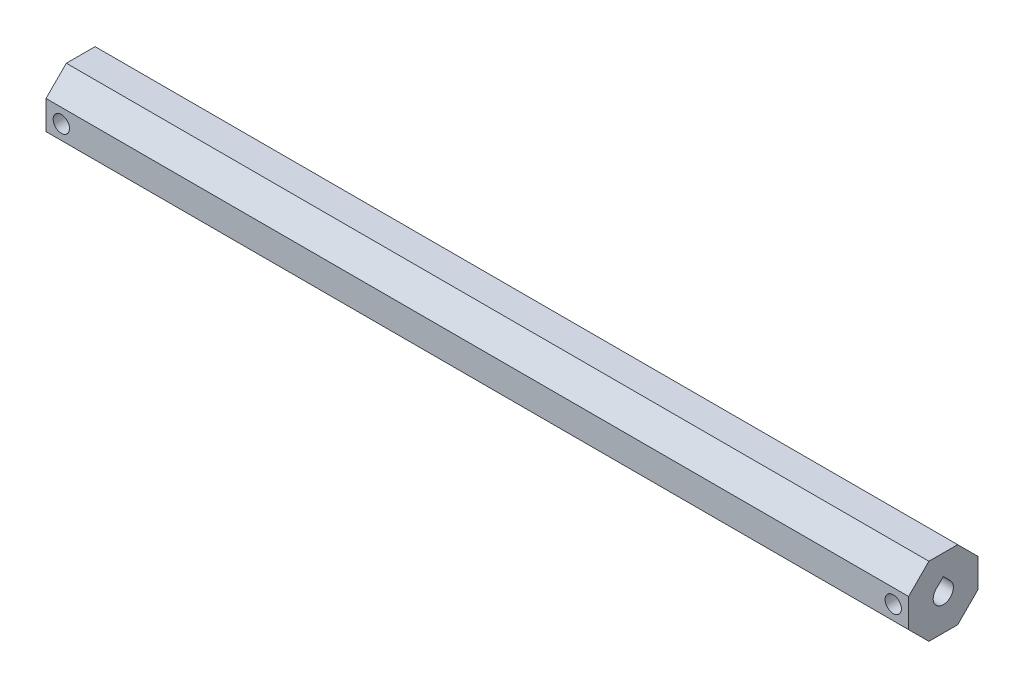
ISO-10303-21;
HEADER;
FILE_DESCRIPTION(('STEP AP214'),'2;1');
FILE_NAME('part.step','',(''),(''),'','','');
FILE_SCHEMA(('AUTOMOTIVE_DESIGN { 1 0 10303 214 1 1 1 1 }'));
ENDSEC;
DATA;
#1=APPLICATION_CONTEXT('core data for automotive mechanical design processes');
#2=APPLICATION_PROTOCOL_DEFINITION('international standard','automotive_design',2000,#1);
#3=PRODUCT_CONTEXT('',#1,'mechanical');
#4=PRODUCT('Part','Part','',(#3));
#5=PRODUCT_RELATED_PRODUCT_CATEGORY('part','',(#4));
#6=PRODUCT_DEFINITION_FORMATION('','',#4);
#7=PRODUCT_DEFINITION_CONTEXT('part definition',#1,'design');
#8=PRODUCT_DEFINITION('design','',#6,#7);
#9=PRODUCT_DEFINITION_SHAPE('','',#8);
#10=(LENGTH_UNIT() NAMED_UNIT(*) SI_UNIT(.MILLI.,.METRE.));
#11=(NAMED_UNIT(*) PLANE_ANGLE_UNIT() SI_UNIT($,.RADIAN.));
#12=(NAMED_UNIT(*) SI_UNIT($,.STERADIAN.) SOLID_ANGLE_UNIT());
#13=UNCERTAINTY_MEASURE_WITH_UNIT(LENGTH_MEASURE(1.E-05),#10,'distance_accuracy_value','');
#14=(GEOMETRIC_REPRESENTATION_CONTEXT(3) GLOBAL_UNCERTAINTY_ASSIGNED_CONTEXT((#13)) GLOBAL_UNIT_ASSIGNED_CONTEXT((#10,
#11,#12)) REPRESENTATION_CONTEXT('',''));
#15=CARTESIAN_POINT('',(0.,0.,0.));
#16=DIRECTION('',(0.,0.,1.));
#17=DIRECTION('',(1.,0.,0.));
#18=AXIS2_PLACEMENT_3D('',#15,#16,#17);
#19=CARTESIAN_POINT('',(0.,0.,0.));
#20=DIRECTION('',(1.,0.,0.));
#21=DIRECTION('',(0.,0.,-1.));
#22=AXIS2_PLACEMENT_3D('',#19,#20,#21);
#23=CYLINDRICAL_SURFACE('',#22,2.63);
#24=CARTESIAN_POINT('',(5.03848447268123,1.85969083452062,1.85969083452062));
#25=CARTESIAN_POINT('',(5.0951160627125,1.82804146435594,1.89135797518973));
#26=CARTESIAN_POINT('',(5.15000136636664,1.79402197696891,1.92374416968312));
#27=CARTESIAN_POINT('',(5.25627855207682,1.72128981403965,1.98907872303995));
#28=CARTESIAN_POINT('',(5.30766821050162,1.68257419399679,2.02202742335799));
#29=CARTESIAN_POINT('',(5.40726992289163,1.60021593778191,2.08782527565308));
#30=CARTESIAN_POINT('',(5.45545396803285,1.55653712105955,2.12067163158908));
#31=CARTESIAN_POINT('',(5.54797875191352,1.46455405557359,2.18520901100423));
#32=CARTESIAN_POINT('',(5.59232072150783,1.41625129866021,2.21690040259083));
#33=CARTESIAN_POINT('',(5.70392621029648,1.28266149181728,2.29806290750954));
#34=CARTESIAN_POINT('',(5.76774691092055,1.19345272932537,2.3459658207599));
#35=CARTESIAN_POINT('',(5.88207084269127,1.00346116916722,2.43327779824418));
#36=CARTESIAN_POINT('',(5.93261851000108,0.902718654771609,2.47271512094149));
#37=CARTESIAN_POINT('',(6.01083299825748,0.708850674166219,2.53435878177116));
#38=CARTESIAN_POINT('',(6.04091362270075,0.617273350655066,2.55834446772752));
#39=CARTESIAN_POINT('',(6.08862339729888,0.428921663345531,2.59656348535034));
#40=CARTESIAN_POINT('',(6.10625504745779,0.332148347209581,2.610798775075));
#41=CARTESIAN_POINT('',(6.12797196683408,0.135742317773496,2.62834985837353));
#42=CARTESIAN_POINT('',(6.13200972521761,0.0361008008171511,2.63162735403424));
#43=CARTESIAN_POINT('',(6.1261150815761,-0.162485649294101,2.62685406841675));
#44=CARTESIAN_POINT('',(6.11618321976725,-0.261430609236712,2.61880372519496));
#45=CARTESIAN_POINT('',(6.08400810229491,-0.449922612376614,2.5928760963468));
#46=CARTESIAN_POINT('',(6.06250809901608,-0.539682526073024,2.57559248248874));
#47=CARTESIAN_POINT('',(6.00887582578313,-0.713885557903072,2.53284828388209));
#48=CARTESIAN_POINT('',(5.97674074700631,-0.798327264428163,2.50738553900094));
#49=CARTESIAN_POINT('',(5.89973771564652,-0.968190560319844,2.4471154699856));
#50=CARTESIAN_POINT('',(5.85395930729148,-1.05296365031704,2.41165643984279));
#51=CARTESIAN_POINT('',(5.75293972542055,-1.21372542864504,2.33489184630584));
#52=CARTESIAN_POINT('',(5.69769374188173,-1.28970961872558,2.29358331292048));
#53=CARTESIAN_POINT('',(5.56673123094268,-1.44735130313582,2.19823072261223));
#54=CARTESIAN_POINT('',(5.48914452607038,-1.52692743271432,2.14332042340501));
#55=CARTESIAN_POINT('',(5.32331713221511,-1.67270683957015,2.03159760187717));
#56=CARTESIAN_POINT('',(5.23506212584814,-1.73889181970878,1.97478259888434));
#57=CARTESIAN_POINT('',(5.05462807776138,-1.85345745172861,1.8674378894907));
#58=CARTESIAN_POINT('',(4.96312129112404,-1.90274127929602,1.81674325516361));
#59=CARTESIAN_POINT('',(4.77080837360695,-1.98841382766638,1.72253803232772));
#60=CARTESIAN_POINT('',(4.67002314973215,-2.02483068642924,1.67901188029474));
#61=CARTESIAN_POINT('',(4.49370290049995,-2.07329506320681,1.61843799463567));
#62=CARTESIAN_POINT('',(4.4206980480358,-2.0894174726342,1.59738652339716));
#63=CARTESIAN_POINT('',(4.27141379944228,-2.11398368605093,1.56473596901652));
#64=CARTESIAN_POINT('',(4.19514265243212,-2.12244576229368,1.55311439956243));
#65=CARTESIAN_POINT('',(4.04065863662922,-2.13102315774334,1.54133261421034));
#66=CARTESIAN_POINT('',(3.96243595024314,-2.13107999374047,1.54125270465107));
#67=CARTESIAN_POINT('',(3.80728712275888,-2.12269157802167,1.55277822386397));
#68=CARTESIAN_POINT('',(3.73036279090047,-2.11423532149556,1.56439877773956));
#69=CARTESIAN_POINT('',(3.56281022395875,-2.0867530378397,1.60093098721445));
#70=CARTESIAN_POINT('',(3.47305901738109,-2.06575585049518,1.62826993410377));
#71=CARTESIAN_POINT('',(3.29992306207162,-2.0137082440087,1.6922078353951));
#72=CARTESIAN_POINT('',(3.2165588394248,-1.98262696548523,1.72883513795149));
#73=CARTESIAN_POINT('',(3.07642578525321,-1.92047259576349,1.79729343683989));
#74=CARTESIAN_POINT('',(3.0182259374661,-1.89134781512773,1.82802753244965));
#75=CARTESIAN_POINT('',(2.90534142736325,-1.82833328862675,1.89105467890705));
#76=CARTESIAN_POINT('',(2.85065837401039,-1.7944413840457,1.9233484316459));
#77=CARTESIAN_POINT('',(2.69172148889042,-1.68576668505589,2.02102613011096));
#78=CARTESIAN_POINT('',(2.59260231491806,-1.60399497338095,2.08719472538144));
#79=CARTESIAN_POINT('',(2.40736108681949,-1.42046975789044,2.21631783662001));
#80=CARTESIAN_POINT('',(2.32153756419276,-1.31835037052084,2.2791819692051));
#81=CARTESIAN_POINT('',(2.16854783093794,-1.09579549059399,2.39409316432904));
#82=CARTESIAN_POINT('',(2.101322731659,-0.975419722412932,2.44617423462145));
#83=CARTESIAN_POINT('',(2.00783409571337,-0.759777513204038,2.51956107151556));
#84=CARTESIAN_POINT('',(1.97534397307195,-0.668730638772767,2.54538528558362));
#85=CARTESIAN_POINT('',(1.92273723428905,-0.480992049145305,2.58742464545609));
#86=CARTESIAN_POINT('',(1.90261104327689,-0.384304765694623,2.60364722659623));
#87=CARTESIAN_POINT('',(1.87592837088297,-0.187421277508353,2.62518911386326));
#88=CARTESIAN_POINT('',(1.86943058368103,-0.0872117775570614,2.63046125821383));
#89=CARTESIAN_POINT('',(1.87064788887946,0.113068693015385,2.62947518816533));
#90=CARTESIAN_POINT('',(1.87836295070491,0.213139663934081,2.62321699857049));
#91=CARTESIAN_POINT('',(1.90649195820296,0.403457408075385,2.60052184341524));
#92=CARTESIAN_POINT('',(1.92604364175712,0.493918959637314,2.58477633952438));
#93=CARTESIAN_POINT('',(1.97598900006543,0.669809330572164,2.54487632597495));
#94=CARTESIAN_POINT('',(2.00638410476584,0.755237484447615,2.5207207072658));
#95=CARTESIAN_POINT('',(2.07950532832982,0.926247222043577,2.4632795156993));
#96=CARTESIAN_POINT('',(2.1230249120794,1.01129159704328,2.42941707627135));
#97=CARTESIAN_POINT('',(2.21956450324894,1.17295835247255,2.35562756141005));
#98=CARTESIAN_POINT('',(2.27259377512116,1.24957240147177,2.31569457780946));
#99=CARTESIAN_POINT('',(2.39835966083387,1.40850924079924,2.22330150774407));
#100=CARTESIAN_POINT('',(2.47291356211949,1.48886214768179,2.16993992809777));
#101=CARTESIAN_POINT('',(2.63233097490823,1.63651635749362,2.06085305126439));
#102=CARTESIAN_POINT('',(2.71718581650323,1.70382851412859,2.00512976719689));
#103=CARTESIAN_POINT('',(2.83192536922825,1.7814066945024,1.93494564820072));
#104=CARTESIAN_POINT('',(2.85731946198986,1.79780360723611,1.91970940907614));
#105=CARTESIAN_POINT('',(2.90884931209322,1.82953674870209,1.88949023850448));
#106=CARTESIAN_POINT('',(2.93498402531604,1.84487437519705,1.87450699375316));
#107=CARTESIAN_POINT('',(2.96151552731877,1.85969083452062,1.85969083452062));
#108=B_SPLINE_CURVE_WITH_KNOTS('',3,(#24,#25,#26,#27,#28,#29,#30,#31,#32,#33,#34,#35,#36,#37,
#38,#39,#40,#41,#42,#43,#44,#45,#46,#47,#48,#49,#50,#51,#52,#53,#54,#55,#56,#57,#58,#59,#60,#61,
#62,#63,#64,#65,#66,#67,#68,#69,#70,#71,#72,#73,#74,#75,#76,#77,#78,#79,#80,#81,#82,#83,#84,#85,
#86,#87,#88,#89,#90,#91,#92,#93,#94,#95,#96,#97,#98,#99,#100,#101,#102,#103,#104,#105,#106,
#107),.UNSPECIFIED.,.F.,.F.,(4,2,2,2,2,2,2,2,2,2,2,2,2,2,2,2,2,2,2,2,2,2,2,2,2,2,2,2,2,2,2,2,2,
2,2,2,2,2,2,2,2,4),(0.,0.21648924591857,0.433114940322423,0.651435591957655,0.869686041348451,
1.22729454456226,1.58369010617176,1.88042295894444,2.17709620483916,2.47480525726397,
2.77250279736244,3.05302719535311,3.33362574166053,3.64049637204913,3.94752337348089,
4.31810368019835,4.6891869637327,5.03509886233567,5.38024955671391,5.6124500892836,
5.84409528138202,6.07735217297174,6.31091098165447,6.59775051445486,6.88547624782633,
7.10112662047158,7.31687496322379,7.7484523809912,8.18863440315681,8.62740628499806,
8.92638085037301,9.22512359115476,9.52515032346801,9.8251764103596,10.1056080075973,
10.3860765996569,10.6890395281592,10.9922992262536,11.3567800019882,11.720956107824,
11.8224907004913,11.9238886487144),.UNSPECIFIED.);
#109=CARTESIAN_POINT('',(5.03848447268123,1.85969083452062,1.85969083452062));
#110=VERTEX_POINT('',#109);
#111=CARTESIAN_POINT('',(2.96151552731877,1.85969083452062,1.85969083452062));
#112=VERTEX_POINT('',#111);
#113=EDGE_CURVE('E61',#110,#112,#108,.T.);
#114=ORIENTED_EDGE('',*,*,#113,.F.);
#115=DIRECTION('',(1.,0.,0.));
#116=VECTOR('',#115,1.);
#117=CARTESIAN_POINT('',(0.,1.85969083452062,1.85969083452062));
#118=LINE('',#117,#116);
#119=CARTESIAN_POINT('',(219.961515527319,1.85969083452062,1.85969083452062));
#120=VERTEX_POINT('',#119);
#121=EDGE_CURVE('E141',#110,#120,#118,.T.);
#122=ORIENTED_EDGE('',*,*,#121,.T.);
#123=CARTESIAN_POINT('',(222.038484472681,1.85969083452062,1.85969083452062));
#124=CARTESIAN_POINT('',(222.095116062712,1.82804146435594,1.89135797518973));
#125=CARTESIAN_POINT('',(222.150001366367,1.79402197696891,1.92374416968311));
#126=CARTESIAN_POINT('',(222.256278552077,1.72128981403966,1.98907872303994));
#127=CARTESIAN_POINT('',(222.307668210502,1.6825741939968,2.02202742335798));
#128=CARTESIAN_POINT('',(222.407269922892,1.60021593778193,2.08782527565306));
#129=CARTESIAN_POINT('',(222.455453968033,1.55653712105957,2.12067163158907));
#130=CARTESIAN_POINT('',(222.547978751913,1.46455405557361,2.18520901100421));
#131=CARTESIAN_POINT('',(222.592320721508,1.41625129866023,2.21690040259081));
#132=CARTESIAN_POINT('',(222.703926210296,1.2826614918173,2.29806290750953));
#133=CARTESIAN_POINT('',(222.767746910921,1.1934527293254,2.34596582075988));
#134=CARTESIAN_POINT('',(222.882070842691,1.00346116916725,2.43327779824417));
#135=CARTESIAN_POINT('',(222.932618510001,0.902718654771629,2.47271512094148));
#136=CARTESIAN_POINT('',(223.010832998257,0.708850674166232,2.53435878177115));
#137=CARTESIAN_POINT('',(223.040913622701,0.617273350655078,2.55834446772752));
#138=CARTESIAN_POINT('',(223.088623397299,0.428921663345544,2.59656348535034));
#139=CARTESIAN_POINT('',(223.106255047458,0.332148347209598,2.610798775075));
#140=CARTESIAN_POINT('',(223.127971966834,0.135742317773517,2.62834985837353));
#141=CARTESIAN_POINT('',(223.132009725218,0.036100800817171,2.63162735403424));
#142=CARTESIAN_POINT('',(223.126115081576,-0.162485649294084,2.62685406841675));
#143=CARTESIAN_POINT('',(223.116183219767,-0.261430609236696,2.61880372519496));
#144=CARTESIAN_POINT('',(223.084008102295,-0.449922612376597,2.5928760963468));
#145=CARTESIAN_POINT('',(223.062508099016,-0.539682526073004,2.57559248248874));
#146=CARTESIAN_POINT('',(223.008875825783,-0.71388555790305,2.5328482838821));
#147=CARTESIAN_POINT('',(222.976740747006,-0.798327264428141,2.50738553900094));
#148=CARTESIAN_POINT('',(222.899737715647,-0.968190560319824,2.44711546998561));
#149=CARTESIAN_POINT('',(222.853959307291,-1.05296365031702,2.4116564398428));
#150=CARTESIAN_POINT('',(222.752939725421,-1.21372542864502,2.33489184630584));
#151=CARTESIAN_POINT('',(222.697693741882,-1.28970961872555,2.29358331292049));
#152=CARTESIAN_POINT('',(222.566731230943,-1.4473513031358,2.19823072261225));
#153=CARTESIAN_POINT('',(222.48914452607,-1.52692743271431,2.14332042340501));
#154=CARTESIAN_POINT('',(222.323317132215,-1.67270683957014,2.03159760187718));
#155=CARTESIAN_POINT('',(222.235062125848,-1.73889181970877,1.97478259888435));
#156=CARTESIAN_POINT('',(222.054628077761,-1.8534574517286,1.86743788949071));
#157=CARTESIAN_POINT('',(221.963121291124,-1.90274127929601,1.81674325516362));
#158=CARTESIAN_POINT('',(221.770808373607,-1.98841382766637,1.72253803232773));
#159=CARTESIAN_POINT('',(221.670023149732,-2.02483068642924,1.67901188029474));
#160=CARTESIAN_POINT('',(221.4937029005,-2.0732950632068,1.61843799463568));
#161=CARTESIAN_POINT('',(221.420698048036,-2.08941747263419,1.59738652339716));
#162=CARTESIAN_POINT('',(221.271413799442,-2.11398368605092,1.56473596901653));
#163=CARTESIAN_POINT('',(221.195142652432,-2.12244576229368,1.55311439956244));
#164=CARTESIAN_POINT('',(221.040658636629,-2.13102315774333,1.54133261421035));
#165=CARTESIAN_POINT('',(220.962435950243,-2.13107999374046,1.54125270465107));
#166=CARTESIAN_POINT('',(220.807287122759,-2.12269157802167,1.55277822386398));
#167=CARTESIAN_POINT('',(220.730362790901,-2.11423532149555,1.56439877773957));
#168=CARTESIAN_POINT('',(220.562810223959,-2.0867530378397,1.60093098721445));
#169=CARTESIAN_POINT('',(220.473059017381,-2.06575585049519,1.62826993410376));
#170=CARTESIAN_POINT('',(220.299923062072,-2.01370824400871,1.69220783539509));
#171=CARTESIAN_POINT('',(220.216558839425,-1.98262696548524,1.72883513795148));
#172=CARTESIAN_POINT('',(220.076425785253,-1.9204725957635,1.79729343683987));
#173=CARTESIAN_POINT('',(220.018225937466,-1.89134781512774,1.82802753244964));
#174=CARTESIAN_POINT('',(219.905341427363,-1.82833328862676,1.89105467890704));
#175=CARTESIAN_POINT('',(219.85065837401,-1.79444138404571,1.92334843164589));
#176=CARTESIAN_POINT('',(219.69172148889,-1.68576668505591,2.02102613011095));
#177=CARTESIAN_POINT('',(219.592602314918,-1.60399497338096,2.08719472538143));
#178=CARTESIAN_POINT('',(219.407361086819,-1.42046975789046,2.21631783662));
#179=CARTESIAN_POINT('',(219.321537564193,-1.31835037052086,2.27918196920509));
#180=CARTESIAN_POINT('',(219.168547830938,-1.09579549059402,2.39409316432902));
#181=CARTESIAN_POINT('',(219.101322731659,-0.975419722412965,2.44617423462144));
#182=CARTESIAN_POINT('',(219.007834095713,-0.759777513204085,2.51956107151555));
#183=CARTESIAN_POINT('',(218.975343973072,-0.668730638772819,2.54538528558361));
#184=CARTESIAN_POINT('',(218.922737234289,-0.480992049145359,2.58742464545608));
#185=CARTESIAN_POINT('',(218.902611043277,-0.384304765694675,2.60364722659623));
#186=CARTESIAN_POINT('',(218.875928370883,-0.187421277508406,2.62518911386326));
#187=CARTESIAN_POINT('',(218.869430583681,-0.0872117775571169,2.63046125821383));
#188=CARTESIAN_POINT('',(218.870647888879,0.113068693015326,2.62947518816533));
#189=CARTESIAN_POINT('',(218.878362950705,0.213139663934022,2.62321699857049));
#190=CARTESIAN_POINT('',(218.906491958203,0.403457408075326,2.60052184341525));
#191=CARTESIAN_POINT('',(218.926043641757,0.493918959637257,2.5847763395244));
#192=CARTESIAN_POINT('',(218.975989000065,0.66980933057211,2.54487632597496));
#193=CARTESIAN_POINT('',(219.006384104766,0.755237484447562,2.52072070726581));
#194=CARTESIAN_POINT('',(219.07950532833,0.926247222043523,2.46327951569932));
#195=CARTESIAN_POINT('',(219.123024912079,1.01129159704323,2.42941707627138));
#196=CARTESIAN_POINT('',(219.219564503249,1.17295835247249,2.35562756141007));
#197=CARTESIAN_POINT('',(219.272593775121,1.24957240147171,2.31569457780949));
#198=CARTESIAN_POINT('',(219.398359660834,1.40850924079919,2.2233015077441));
#199=CARTESIAN_POINT('',(219.472913562119,1.48886214768174,2.1699399280978));
#200=CARTESIAN_POINT('',(219.632330974908,1.63651635749358,2.06085305126442));
#201=CARTESIAN_POINT('',(219.717185816503,1.70382851412855,2.00512976719693));
#202=CARTESIAN_POINT('',(219.831925369228,1.78140669450237,1.93494564820075));
#203=CARTESIAN_POINT('',(219.85731946199,1.79780360723608,1.91970940907617));
#204=CARTESIAN_POINT('',(219.908849312093,1.82953674870208,1.88949023850449));
#205=CARTESIAN_POINT('',(219.934984025316,1.84487437519704,1.87450699375317));
#206=CARTESIAN_POINT('',(219.961515527319,1.85969083452062,1.85969083452062));
#207=B_SPLINE_CURVE_WITH_KNOTS('',3,(#123,#124,#125,#126,#127,#128,#129,#130,#131,#132,#133,
#134,#135,#136,#137,#138,#139,#140,#141,#142,#143,#144,#145,#146,#147,#148,#149,#150,#151,#152,
#153,#154,#155,#156,#157,#158,#159,#160,#161,#162,#163,#164,#165,#166,#167,#168,#169,#170,#171,
#172,#173,#174,#175,#176,#177,#178,#179,#180,#181,#182,#183,#184,#185,#186,#187,#188,#189,#190,
#191,#192,#193,#194,#195,#196,#197,#198,#199,#200,#201,#202,#203,#204,#205,#206),.UNSPECIFIED.,
.F.,.F.,(4,2,2,2,2,2,2,2,2,2,2,2,2,2,2,2,2,2,2,2,2,2,2,2,2,2,2,2,2,2,2,2,2,2,2,2,2,2,2,2,2,4),
(0.,0.21648924591855,0.433114940322415,0.651435591957615,0.869686041348436,1.22729454456224,
1.58369010617175,1.88042295894445,2.17709620483915,2.47480525726397,2.77250279736244,
3.05302719535311,3.33362574166052,3.64049637204912,3.94752337348088,4.31810368019836,
4.6891869637327,5.03509886233568,5.38024955671394,5.6124500892836,5.84409528138201,
6.07735217297174,6.31091098165444,6.59775051445479,6.88547624782628,7.10112662047153,
7.31687496322377,7.74845238099118,8.18863440315679,8.627406284998,8.92638085037295,
9.22512359115471,9.52515032346794,9.82517641035953,10.1056080075973,10.3860765996568,
10.6890395281592,10.9922992262535,11.3567800019881,11.7209561078239,11.8224907004912,
11.9238886487144),.UNSPECIFIED.);
#208=CARTESIAN_POINT('',(222.038484472681,1.85969083452062,1.85969083452062));
#209=VERTEX_POINT('',#208);
#210=EDGE_CURVE('E55',#209,#120,#207,.T.);
#211=ORIENTED_EDGE('',*,*,#210,.F.);
#212=CARTESIAN_POINT('',(225.,1.85969083452062,1.85969083452062));
#213=VERTEX_POINT('',#212);
#214=EDGE_CURVE('E139',#209,#213,#118,.T.);
#215=ORIENTED_EDGE('',*,*,#214,.T.);
#216=CARTESIAN_POINT('',(225.,0.,0.));
#217=DIRECTION('',(1.,0.,0.));
#218=DIRECTION('',(0.,0.,-1.));
#219=AXIS2_PLACEMENT_3D('',#216,#217,#218);
#220=CIRCLE('',#219,2.63);
#221=CARTESIAN_POINT('',(225.,1.85969083452062,-1.85969083452062));
#222=VERTEX_POINT('',#221);
#223=EDGE_CURVE('E291',#213,#222,#220,.T.);
#224=ORIENTED_EDGE('',*,*,#223,.T.);
#225=DIRECTION('',(1.,0.,0.));
#226=VECTOR('',#225,1.);
#227=CARTESIAN_POINT('',(0.,1.85969083452062,-1.85969083452062));
#228=LINE('',#227,#226);
#229=CARTESIAN_POINT('',(0.,1.85969083452062,-1.85969083452062));
#230=VERTEX_POINT('',#229);
#231=EDGE_CURVE('E151',#230,#222,#228,.T.);
#232=ORIENTED_EDGE('',*,*,#231,.F.);
#233=CARTESIAN_POINT('',(0.,0.,0.));
#234=DIRECTION('',(1.,0.,0.));
#235=DIRECTION('',(0.,0.,-1.));
#236=AXIS2_PLACEMENT_3D('',#233,#234,#235);
#237=CIRCLE('',#236,2.63);
#238=CARTESIAN_POINT('',(0.,1.85969083452062,1.85969083452062));
#239=VERTEX_POINT('',#238);
#240=EDGE_CURVE('E292',#239,#230,#237,.T.);
#241=ORIENTED_EDGE('',*,*,#240,.F.);
#242=EDGE_CURVE('E150',#239,#112,#118,.T.);
#243=ORIENTED_EDGE('',*,*,#242,.T.);
#244=EDGE_LOOP('',(#114,#122,#211,#215,#224,#232,#241,#243));
#245=FACE_BOUND('',#244,.T.);
#246=ADVANCED_FACE('F41',(#245),#23,.F.);
#247=CARTESIAN_POINT('',(225.,-9.0533008588991,-3.74999999999999));
#248=DIRECTION('',(0.,0.707106781186548,0.707106781186547));
#249=DIRECTION('',(0.,-0.707106781186547,0.707106781186548));
#250=AXIS2_PLACEMENT_3D('',#247,#248,#249);
#251=PLANE('',#250);
#252=DIRECTION('',(0.,0.707106781186547,-0.707106781186548));
#253=VECTOR('',#252,1.);
#254=CARTESIAN_POINT('',(0.,-9.0533008588991,-3.74999999999999));
#255=LINE('',#254,#253);
#256=CARTESIAN_POINT('',(0.,-9.0533008588991,-3.74999999999999));
#257=VERTEX_POINT('',#256);
#258=CARTESIAN_POINT('',(0.,-3.75,-9.0533008588991));
#259=VERTEX_POINT('',#258);
#260=EDGE_CURVE('E155',#257,#259,#255,.T.);
#261=ORIENTED_EDGE('',*,*,#260,.T.);
#262=DIRECTION('',(-1.,0.,0.));
#263=VECTOR('',#262,1.);
#264=CARTESIAN_POINT('',(225.,-3.75,-9.0533008588991));
#265=LINE('',#264,#263);
#266=CARTESIAN_POINT('',(225.,-3.75,-9.0533008588991));
#267=VERTEX_POINT('',#266);
#268=EDGE_CURVE('E137',#267,#259,#265,.T.);
#269=ORIENTED_EDGE('',*,*,#268,.F.);
#270=DIRECTION('',(0.,0.707106781186547,-0.707106781186548));
#271=VECTOR('',#270,1.);
#272=CARTESIAN_POINT('',(225.,-9.0533008588991,-3.74999999999999));
#273=LINE('',#272,#271);
#274=CARTESIAN_POINT('',(225.,-9.0533008588991,-3.74999999999999));
#275=VERTEX_POINT('',#274);
#276=EDGE_CURVE('E181',#275,#267,#273,.T.);
#277=ORIENTED_EDGE('',*,*,#276,.F.);
#278=DIRECTION('',(-1.,0.,0.));
#279=VECTOR('',#278,1.);
#280=CARTESIAN_POINT('',(225.,-9.0533008588991,-3.74999999999999));
#281=LINE('',#280,#279);
#282=EDGE_CURVE('E182',#275,#257,#281,.T.);
#283=ORIENTED_EDGE('',*,*,#282,.T.);
#284=EDGE_LOOP('',(#261,#269,#277,#283));
#285=FACE_BOUND('',#284,.T.);
#286=ADVANCED_FACE('F43',(#285),#251,.F.);
#287=CARTESIAN_POINT('',(225.,-3.75,-9.0533008588991));
#288=DIRECTION('',(0.,0.,1.));
#289=DIRECTION('',(1.,0.,0.));
#290=AXIS2_PLACEMENT_3D('',#287,#288,#289);
#291=PLANE('',#290);
#292=DIRECTION('',(0.,1.,0.));
#293=VECTOR('',#292,1.);
#294=CARTESIAN_POINT('',(0.,-3.75,-9.0533008588991));
#295=LINE('',#294,#293);
#296=CARTESIAN_POINT('',(0.,3.75,-9.0533008588991));
#297=VERTEX_POINT('',#296);
#298=EDGE_CURVE('E158',#259,#297,#295,.T.);
#299=ORIENTED_EDGE('',*,*,#298,.T.);
#300=DIRECTION('',(-1.,0.,0.));
#301=VECTOR('',#300,1.);
#302=CARTESIAN_POINT('',(225.,3.75,-9.0533008588991));
#303=LINE('',#302,#301);
#304=CARTESIAN_POINT('',(225.,3.75,-9.0533008588991));
#305=VERTEX_POINT('',#304);
#306=EDGE_CURVE('E199',#305,#297,#303,.T.);
#307=ORIENTED_EDGE('',*,*,#306,.F.);
#308=DIRECTION('',(0.,1.,0.));
#309=VECTOR('',#308,1.);
#310=CARTESIAN_POINT('',(225.,-3.75,-9.0533008588991));
#311=LINE('',#310,#309);
#312=EDGE_CURVE('E206',#267,#305,#311,.T.);
#313=ORIENTED_EDGE('',*,*,#312,.F.);
#314=ORIENTED_EDGE('',*,*,#268,.T.);
#315=EDGE_LOOP('',(#299,#307,#313,#314));
#316=FACE_BOUND('',#315,.T.);
#317=ADVANCED_FACE('F204',(#316),#291,.F.);
#318=CARTESIAN_POINT('',(225.,3.75,-9.0533008588991));
#319=DIRECTION('',(0.,-0.707106781186547,0.707106781186548));
#320=DIRECTION('',(0.,-0.707106781186548,-0.707106781186547));
#321=AXIS2_PLACEMENT_3D('',#318,#319,#320);
#322=PLANE('',#321);
#323=DIRECTION('',(0.,0.707106781186548,0.707106781186547));
#324=VECTOR('',#323,1.);
#325=CARTESIAN_POINT('',(0.,3.75,-9.0533008588991));
#326=LINE('',#325,#324);
#327=CARTESIAN_POINT('',(0.,9.0533008588991,-3.75));
#328=VERTEX_POINT('',#327);
#329=EDGE_CURVE('E164',#297,#328,#326,.T.);
#330=ORIENTED_EDGE('',*,*,#329,.T.);
#331=DIRECTION('',(-1.,0.,0.));
#332=VECTOR('',#331,1.);
#333=CARTESIAN_POINT('',(225.,9.0533008588991,-3.75));
#334=LINE('',#333,#332);
#335=CARTESIAN_POINT('',(225.,9.0533008588991,-3.75));
#336=VERTEX_POINT('',#335);
#337=EDGE_CURVE('E196',#336,#328,#334,.T.);
#338=ORIENTED_EDGE('',*,*,#337,.F.);
#339=DIRECTION('',(0.,0.707106781186548,0.707106781186547));
#340=VECTOR('',#339,1.);
#341=CARTESIAN_POINT('',(225.,3.75,-9.0533008588991));
#342=LINE('',#341,#340);
#343=EDGE_CURVE('E212',#305,#336,#342,.T.);
#344=ORIENTED_EDGE('',*,*,#343,.F.);
#345=ORIENTED_EDGE('',*,*,#306,.T.);
#346=EDGE_LOOP('',(#330,#338,#344,#345));
#347=FACE_BOUND('',#346,.T.);
#348=ADVANCED_FACE('F239',(#347),#322,.F.);
#349=CARTESIAN_POINT('',(225.,9.0533008588991,-3.75));
#350=DIRECTION('',(0.,-1.,0.));
#351=DIRECTION('',(0.,0.,-1.));
#352=AXIS2_PLACEMENT_3D('',#349,#350,#351);
#353=PLANE('',#352);
#354=DIRECTION('',(0.,0.,1.));
#355=VECTOR('',#354,1.);
#356=CARTESIAN_POINT('',(0.,9.0533008588991,-3.75));
#357=LINE('',#356,#355);
#358=CARTESIAN_POINT('',(0.,9.0533008588991,3.75));
#359=VERTEX_POINT('',#358);
#360=EDGE_CURVE('E171',#328,#359,#357,.T.);
#361=ORIENTED_EDGE('',*,*,#360,.T.);
#362=DIRECTION('',(-1.,0.,0.));
#363=VECTOR('',#362,1.);
#364=CARTESIAN_POINT('',(225.,9.0533008588991,3.75));
#365=LINE('',#364,#363);
#366=CARTESIAN_POINT('',(225.,9.0533008588991,3.75));
#367=VERTEX_POINT('',#366);
#368=EDGE_CURVE('E193',#367,#359,#365,.T.);
#369=ORIENTED_EDGE('',*,*,#368,.F.);
#370=DIRECTION('',(0.,0.,1.));
#371=VECTOR('',#370,1.);
#372=CARTESIAN_POINT('',(225.,9.0533008588991,-3.75));
#373=LINE('',#372,#371);
#374=EDGE_CURVE('E217',#336,#367,#373,.T.);
#375=ORIENTED_EDGE('',*,*,#374,.F.);
#376=ORIENTED_EDGE('',*,*,#337,.T.);
#377=EDGE_LOOP('',(#361,#369,#375,#376));
#378=FACE_BOUND('',#377,.T.);
#379=ADVANCED_FACE('F243',(#378),#353,.F.);
#380=CARTESIAN_POINT('',(225.,9.0533008588991,3.75));
#381=DIRECTION('',(0.,-0.707106781186547,-0.707106781186548));
#382=DIRECTION('',(0.,0.707106781186548,-0.707106781186547));
#383=AXIS2_PLACEMENT_3D('',#380,#381,#382);
#384=PLANE('',#383);
#385=DIRECTION('',(0.,-0.707106781186548,0.707106781186547));
#386=VECTOR('',#385,1.);
#387=CARTESIAN_POINT('',(0.,9.0533008588991,3.75));
#388=LINE('',#387,#386);
#389=CARTESIAN_POINT('',(0.,3.75,9.0533008588991));
#390=VERTEX_POINT('',#389);
#391=EDGE_CURVE('E173',#359,#390,#388,.T.);
#392=ORIENTED_EDGE('',*,*,#391,.T.);
#393=DIRECTION('',(-1.,0.,0.));
#394=VECTOR('',#393,1.);
#395=CARTESIAN_POINT('',(225.,3.75,9.0533008588991));
#396=LINE('',#395,#394);
#397=CARTESIAN_POINT('',(225.,3.75,9.0533008588991));
#398=VERTEX_POINT('',#397);
#399=EDGE_CURVE('E190',#398,#390,#396,.T.);
#400=ORIENTED_EDGE('',*,*,#399,.F.);
#401=DIRECTION('',(0.,-0.707106781186548,0.707106781186547));
#402=VECTOR('',#401,1.);
#403=CARTESIAN_POINT('',(225.,9.0533008588991,3.75));
#404=LINE('',#403,#402);
#405=EDGE_CURVE('E219',#367,#398,#404,.T.);
#406=ORIENTED_EDGE('',*,*,#405,.F.);
#407=ORIENTED_EDGE('',*,*,#368,.T.);
#408=EDGE_LOOP('',(#392,#400,#406,#407));
#409=FACE_BOUND('',#408,.T.);
#410=ADVANCED_FACE('F250',(#409),#384,.F.);
#411=CARTESIAN_POINT('',(225.,3.75,9.0533008588991));
#412=DIRECTION('',(0.,0.,-1.));
#413=DIRECTION('',(0.,1.,0.));
#414=AXIS2_PLACEMENT_3D('',#411,#412,#413);
#415=PLANE('',#414);
#416=CARTESIAN_POINT('',(4.,0.,9.0533008588991));
#417=DIRECTION('',(0.,0.,-1.));
#418=DIRECTION('',(-1.,0.,0.));
#419=AXIS2_PLACEMENT_3D('',#416,#417,#418);
#420=CIRCLE('',#419,2.13);
#421=CARTESIAN_POINT('',(1.87,0.,9.0533008588991));
#422=VERTEX_POINT('',#421);
#423=EDGE_CURVE('E142',#422,#422,#420,.T.);
#424=ORIENTED_EDGE('',*,*,#423,.T.);
#425=EDGE_LOOP('',(#424));
#426=FACE_BOUND('',#425,.T.);
#427=CARTESIAN_POINT('',(221.,0.,9.0533008588991));
#428=DIRECTION('',(0.,0.,-1.));
#429=DIRECTION('',(-1.,0.,0.));
#430=AXIS2_PLACEMENT_3D('',#427,#428,#429);
#431=CIRCLE('',#430,2.12999999999999);
#432=CARTESIAN_POINT('',(218.87,0.,9.0533008588991));
#433=VERTEX_POINT('',#432);
#434=EDGE_CURVE('E415',#433,#433,#431,.T.);
#435=ORIENTED_EDGE('',*,*,#434,.T.);
#436=EDGE_LOOP('',(#435));
#437=FACE_BOUND('',#436,.T.);
#438=DIRECTION('',(0.,-1.,0.));
#439=VECTOR('',#438,1.);
#440=CARTESIAN_POINT('',(0.,3.75,9.0533008588991));
#441=LINE('',#440,#439);
#442=CARTESIAN_POINT('',(0.,-3.74999999999999,9.0533008588991));
#443=VERTEX_POINT('',#442);
#444=EDGE_CURVE('E175',#390,#443,#441,.T.);
#445=ORIENTED_EDGE('',*,*,#444,.T.);
#446=DIRECTION('',(-1.,0.,0.));
#447=VECTOR('',#446,1.);
#448=CARTESIAN_POINT('',(225.,-3.74999999999999,9.0533008588991));
#449=LINE('',#448,#447);
#450=CARTESIAN_POINT('',(225.,-3.74999999999999,9.0533008588991));
#451=VERTEX_POINT('',#450);
#452=EDGE_CURVE('E187',#451,#443,#449,.T.);
#453=ORIENTED_EDGE('',*,*,#452,.F.);
#454=DIRECTION('',(0.,-1.,0.));
#455=VECTOR('',#454,1.);
#456=CARTESIAN_POINT('',(225.,3.75,9.0533008588991));
#457=LINE('',#456,#455);
#458=EDGE_CURVE('E221',#398,#451,#457,.T.);
#459=ORIENTED_EDGE('',*,*,#458,.F.);
#460=ORIENTED_EDGE('',*,*,#399,.T.);
#461=EDGE_LOOP('',(#445,#453,#459,#460));
#462=FACE_BOUND('',#461,.T.);
#463=ADVANCED_FACE('F252',(#426,#437,#462),#415,.F.);
#464=CARTESIAN_POINT('',(225.,-3.74999999999999,9.0533008588991));
#465=DIRECTION('',(0.,0.707106781186547,-0.707106781186548));
#466=DIRECTION('',(0.,0.707106781186548,0.707106781186547));
#467=AXIS2_PLACEMENT_3D('',#464,#465,#466);
#468=PLANE('',#467);
#469=DIRECTION('',(0.,-0.707106781186548,-0.707106781186547));
#470=VECTOR('',#469,1.);
#471=CARTESIAN_POINT('',(0.,-3.74999999999999,9.0533008588991));
#472=LINE('',#471,#470);
#473=CARTESIAN_POINT('',(0.,-9.0533008588991,3.75));
#474=VERTEX_POINT('',#473);
#475=EDGE_CURVE('E177',#443,#474,#472,.T.);
#476=ORIENTED_EDGE('',*,*,#475,.T.);
#477=DIRECTION('',(-1.,0.,0.));
#478=VECTOR('',#477,1.);
#479=CARTESIAN_POINT('',(225.,-9.0533008588991,3.75));
#480=LINE('',#479,#478);
#481=CARTESIAN_POINT('',(225.,-9.0533008588991,3.75));
#482=VERTEX_POINT('',#481);
#483=EDGE_CURVE('E184',#482,#474,#480,.T.);
#484=ORIENTED_EDGE('',*,*,#483,.F.);
#485=DIRECTION('',(0.,-0.707106781186548,-0.707106781186547));
#486=VECTOR('',#485,1.);
#487=CARTESIAN_POINT('',(225.,-3.74999999999999,9.0533008588991));
#488=LINE('',#487,#486);
#489=EDGE_CURVE('E222',#451,#482,#488,.T.);
#490=ORIENTED_EDGE('',*,*,#489,.F.);
#491=ORIENTED_EDGE('',*,*,#452,.T.);
#492=EDGE_LOOP('',(#476,#484,#490,#491));
#493=FACE_BOUND('',#492,.T.);
#494=ADVANCED_FACE('F254',(#493),#468,.F.);
#495=CARTESIAN_POINT('',(225.,-9.0533008588991,3.75));
#496=DIRECTION('',(0.,1.,0.));
#497=DIRECTION('',(0.,0.,1.));
#498=AXIS2_PLACEMENT_3D('',#495,#496,#497);
#499=PLANE('',#498);
#500=DIRECTION('',(0.,0.,-1.));
#501=VECTOR('',#500,1.);
#502=CARTESIAN_POINT('',(0.,-9.0533008588991,3.75));
#503=LINE('',#502,#501);
#504=EDGE_CURVE('E179',#474,#257,#503,.T.);
#505=ORIENTED_EDGE('',*,*,#504,.T.);
#506=ORIENTED_EDGE('',*,*,#282,.F.);
#507=DIRECTION('',(0.,0.,-1.));
#508=VECTOR('',#507,1.);
#509=CARTESIAN_POINT('',(225.,-9.0533008588991,3.75));
#510=LINE('',#509,#508);
#511=EDGE_CURVE('E167',#482,#275,#510,.T.);
#512=ORIENTED_EDGE('',*,*,#511,.F.);
#513=ORIENTED_EDGE('',*,*,#483,.T.);
#514=EDGE_LOOP('',(#505,#506,#512,#513));
#515=FACE_BOUND('',#514,.T.);
#516=ADVANCED_FACE('F228',(#515),#499,.F.);
#517=CARTESIAN_POINT('',(225.,0.,0.));
#518=DIRECTION('',(1.,0.,0.));
#519=DIRECTION('',(0.,0.,-1.));
#520=AXIS2_PLACEMENT_3D('',#517,#518,#519);
#521=PLANE('',#520);
#522=ORIENTED_EDGE('',*,*,#223,.F.);
#523=DIRECTION('',(0.,-0.707106781186548,0.707106781186547));
#524=VECTOR('',#523,1.);
#525=CARTESIAN_POINT('',(225.,1.85969083452062,1.85969083452062));
#526=LINE('',#525,#524);
#527=CARTESIAN_POINT('',(225.,3.71938166904124,0.));
#528=VERTEX_POINT('',#527);
#529=EDGE_CURVE('E146',#528,#213,#526,.T.);
#530=ORIENTED_EDGE('',*,*,#529,.F.);
#531=DIRECTION('',(0.,0.707106781186548,0.707106781186547));
#532=VECTOR('',#531,1.);
#533=CARTESIAN_POINT('',(225.,3.71938166904124,0.));
#534=LINE('',#533,#532);
#535=EDGE_CURVE('E322',#222,#528,#534,.T.);
#536=ORIENTED_EDGE('',*,*,#535,.F.);
#537=EDGE_LOOP('',(#522,#530,#536));
#538=FACE_BOUND('',#537,.T.);
#539=ORIENTED_EDGE('',*,*,#276,.T.);
#540=ORIENTED_EDGE('',*,*,#312,.T.);
#541=ORIENTED_EDGE('',*,*,#343,.T.);
#542=ORIENTED_EDGE('',*,*,#374,.T.);
#543=ORIENTED_EDGE('',*,*,#405,.T.);
#544=ORIENTED_EDGE('',*,*,#458,.T.);
#545=ORIENTED_EDGE('',*,*,#489,.T.);
#546=ORIENTED_EDGE('',*,*,#511,.T.);
#547=EDGE_LOOP('',(#539,#540,#541,#542,#543,#544,#545,#546));
#548=FACE_BOUND('',#547,.T.);
#549=ADVANCED_FACE('F226',(#538,#548),#521,.T.);
#550=CARTESIAN_POINT('',(0.,0.,0.));
#551=DIRECTION('',(1.,0.,0.));
#552=DIRECTION('',(0.,0.,-1.));
#553=AXIS2_PLACEMENT_3D('',#550,#551,#552);
#554=PLANE('',#553);
#555=DIRECTION('',(0.,-0.707106781186548,0.707106781186547));
#556=VECTOR('',#555,1.);
#557=CARTESIAN_POINT('',(0.,1.85969083452062,1.85969083452062));
#558=LINE('',#557,#556);
#559=CARTESIAN_POINT('',(0.,3.71938166904124,0.));
#560=VERTEX_POINT('',#559);
#561=EDGE_CURVE('E314',#560,#239,#558,.T.);
#562=ORIENTED_EDGE('',*,*,#561,.T.);
#563=ORIENTED_EDGE('',*,*,#240,.T.);
#564=DIRECTION('',(0.,0.707106781186548,0.707106781186547));
#565=VECTOR('',#564,1.);
#566=CARTESIAN_POINT('',(0.,3.71938166904124,0.));
#567=LINE('',#566,#565);
#568=EDGE_CURVE('E316',#230,#560,#567,.T.);
#569=ORIENTED_EDGE('',*,*,#568,.T.);
#570=EDGE_LOOP('',(#562,#563,#569));
#571=FACE_BOUND('',#570,.T.);
#572=ORIENTED_EDGE('',*,*,#260,.F.);
#573=ORIENTED_EDGE('',*,*,#504,.F.);
#574=ORIENTED_EDGE('',*,*,#475,.F.);
#575=ORIENTED_EDGE('',*,*,#444,.F.);
#576=ORIENTED_EDGE('',*,*,#391,.F.);
#577=ORIENTED_EDGE('',*,*,#360,.F.);
#578=ORIENTED_EDGE('',*,*,#329,.F.);
#579=ORIENTED_EDGE('',*,*,#298,.F.);
#580=EDGE_LOOP('',(#572,#573,#574,#575,#576,#577,#578,#579));
#581=FACE_BOUND('',#580,.T.);
#582=ADVANCED_FACE('F232',(#571,#581),#554,.F.);
#583=CARTESIAN_POINT('',(0.,1.85969083452062,1.85969083452062));
#584=DIRECTION('',(0.,0.707106781186548,0.707106781186548));
#585=DIRECTION('',(0.,-0.707106781186548,0.707106781186547));
#586=AXIS2_PLACEMENT_3D('',#583,#584,#585);
#587=PLANE('',#586);
#588=CARTESIAN_POINT('',(4.,0.,3.71938166904123));
#589=DIRECTION('',(0.,0.707106781186548,0.707106781186548));
#590=DIRECTION('',(0.,-0.707106781186548,0.707106781186547));
#591=AXIS2_PLACEMENT_3D('',#588,#589,#590);
#592=ELLIPSE('',#591,3.01227488785469,2.13);
#593=EDGE_CURVE('E11',#112,#110,#592,.F.);
#594=ORIENTED_EDGE('',*,*,#593,.F.);
#595=ORIENTED_EDGE('',*,*,#242,.F.);
#596=ORIENTED_EDGE('',*,*,#561,.F.);
#597=DIRECTION('',(1.,0.,0.));
#598=VECTOR('',#597,1.);
#599=CARTESIAN_POINT('',(0.,3.71938166904124,0.));
#600=LINE('',#599,#598);
#601=EDGE_CURVE('E148',#560,#528,#600,.T.);
#602=ORIENTED_EDGE('',*,*,#601,.T.);
#603=ORIENTED_EDGE('',*,*,#529,.T.);
#604=ORIENTED_EDGE('',*,*,#214,.F.);
#605=CARTESIAN_POINT('',(221.,0.,3.71938166904123));
#606=DIRECTION('',(0.,0.707106781186548,0.707106781186548));
#607=DIRECTION('',(0.,-0.707106781186548,0.707106781186547));
#608=AXIS2_PLACEMENT_3D('',#605,#606,#607);
#609=ELLIPSE('',#608,3.01227488785468,2.12999999999999);
#610=EDGE_CURVE('E49',#120,#209,#609,.F.);
#611=ORIENTED_EDGE('',*,*,#610,.F.);
#612=ORIENTED_EDGE('',*,*,#121,.F.);
#613=EDGE_LOOP('',(#594,#595,#596,#602,#603,#604,#611,#612));
#614=FACE_BOUND('',#613,.T.);
#615=ADVANCED_FACE('F144',(#614),#587,.F.);
#616=CARTESIAN_POINT('',(0.,3.71938166904124,0.));
#617=DIRECTION('',(0.,0.707106781186548,-0.707106781186548));
#618=DIRECTION('',(0.,0.707106781186548,0.707106781186547));
#619=AXIS2_PLACEMENT_3D('',#616,#617,#618);
#620=PLANE('',#619);
#621=ORIENTED_EDGE('',*,*,#535,.T.);
#622=ORIENTED_EDGE('',*,*,#601,.F.);
#623=ORIENTED_EDGE('',*,*,#568,.F.);
#624=ORIENTED_EDGE('',*,*,#231,.T.);
#625=EDGE_LOOP('',(#621,#622,#623,#624));
#626=FACE_BOUND('',#625,.T.);
#627=ADVANCED_FACE('F274',(#626),#620,.F.);
#628=CARTESIAN_POINT('',(221.,0.,0.553300858899097));
#629=DIRECTION('',(0.,0.,1.));
#630=DIRECTION('',(1.,0.,0.));
#631=AXIS2_PLACEMENT_3D('',#628,#629,#630);
#632=CYLINDRICAL_SURFACE('',#631,2.12999999999999);
#633=ORIENTED_EDGE('',*,*,#434,.F.);
#634=EDGE_LOOP('',(#633));
#635=FACE_BOUND('',#634,.T.);
#636=ORIENTED_EDGE('',*,*,#210,.T.);
#637=ORIENTED_EDGE('',*,*,#610,.T.);
#638=EDGE_LOOP('',(#636,#637));
#639=FACE_BOUND('',#638,.T.);
#640=ADVANCED_FACE('F132',(#635,#639),#632,.F.);
#641=CARTESIAN_POINT('',(4.,0.,0.553300858899097));
#642=DIRECTION('',(0.,0.,1.));
#643=DIRECTION('',(1.,0.,0.));
#644=AXIS2_PLACEMENT_3D('',#641,#642,#643);
#645=CYLINDRICAL_SURFACE('',#644,2.13);
#646=ORIENTED_EDGE('',*,*,#423,.F.);
#647=EDGE_LOOP('',(#646));
#648=FACE_BOUND('',#647,.T.);
#649=ORIENTED_EDGE('',*,*,#113,.T.);
#650=ORIENTED_EDGE('',*,*,#593,.T.);
#651=EDGE_LOOP('',(#649,#650));
#652=FACE_BOUND('',#651,.T.);
#653=ADVANCED_FACE('F294',(#648,#652),#645,.F.);
#654=CLOSED_SHELL('',(#246,#286,#317,#348,#379,#410,#463,#494,#516,#549,#582,#615,#627,#640,#653));
#655=MANIFOLD_SOLID_BREP('B2',#654);
#656=ADVANCED_BREP_SHAPE_REPRESENTATION('',(#18,#655),#14);
#657=SHAPE_DEFINITION_REPRESENTATION(#9,#656);
ENDSEC;
END-ISO-10303-21;
